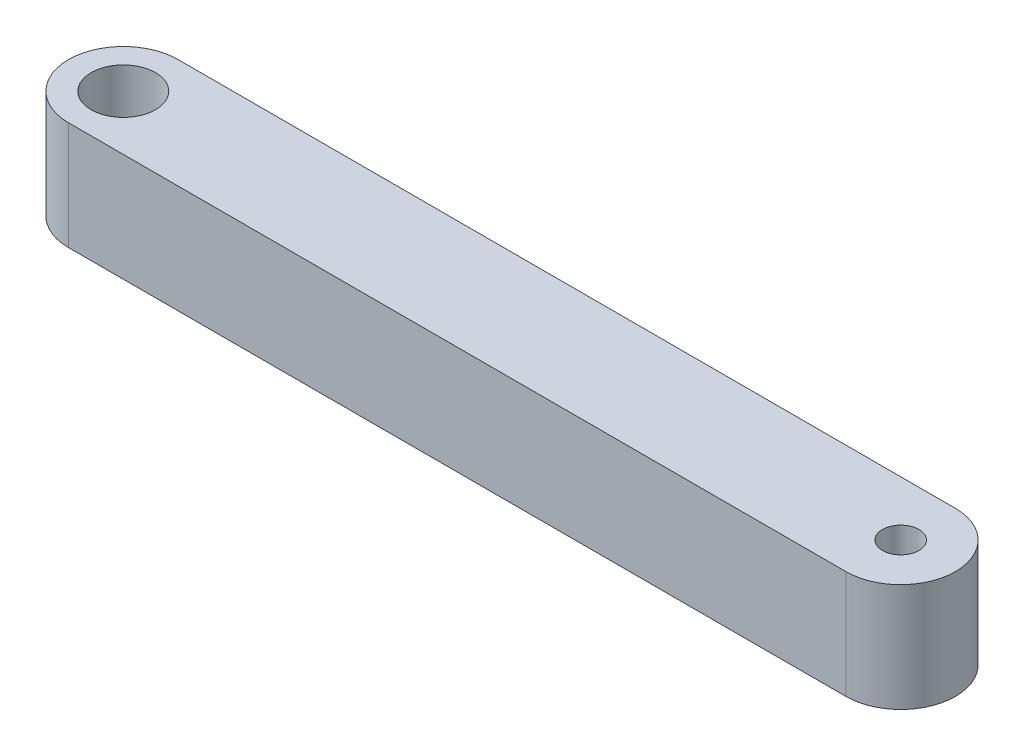
ISO-10303-21;
HEADER;
FILE_DESCRIPTION(('STEP AP214'),'2;1');
FILE_NAME('part.step','',(''),(''),'','','');
FILE_SCHEMA(('AUTOMOTIVE_DESIGN { 1 0 10303 214 1 1 1 1 }'));
ENDSEC;
DATA;
#1=APPLICATION_CONTEXT('core data for automotive mechanical design processes');
#2=APPLICATION_PROTOCOL_DEFINITION('international standard','automotive_design',2000,#1);
#3=PRODUCT_CONTEXT('',#1,'mechanical');
#4=PRODUCT('Part','Part','',(#3));
#5=PRODUCT_RELATED_PRODUCT_CATEGORY('part','',(#4));
#6=PRODUCT_DEFINITION_FORMATION('','',#4);
#7=PRODUCT_DEFINITION_CONTEXT('part definition',#1,'design');
#8=PRODUCT_DEFINITION('design','',#6,#7);
#9=PRODUCT_DEFINITION_SHAPE('','',#8);
#10=(LENGTH_UNIT() NAMED_UNIT(*) SI_UNIT(.MILLI.,.METRE.));
#11=(NAMED_UNIT(*) PLANE_ANGLE_UNIT() SI_UNIT($,.RADIAN.));
#12=(NAMED_UNIT(*) SI_UNIT($,.STERADIAN.) SOLID_ANGLE_UNIT());
#13=UNCERTAINTY_MEASURE_WITH_UNIT(LENGTH_MEASURE(1.E-05),#10,'distance_accuracy_value','');
#14=(GEOMETRIC_REPRESENTATION_CONTEXT(3) GLOBAL_UNCERTAINTY_ASSIGNED_CONTEXT((#13)) GLOBAL_UNIT_ASSIGNED_CONTEXT((#10,
#11,#12)) REPRESENTATION_CONTEXT('',''));
#15=CARTESIAN_POINT('',(0.,0.,0.));
#16=DIRECTION('',(0.,0.,1.));
#17=DIRECTION('',(1.,0.,0.));
#18=AXIS2_PLACEMENT_3D('',#15,#16,#17);
#19=CARTESIAN_POINT('',(-17.2988402061856,5.334,-1.94406013745705));
#20=DIRECTION('',(0.,1.,0.));
#21=DIRECTION('',(0.,0.,1.));
#22=AXIS2_PLACEMENT_3D('',#19,#20,#21);
#23=PLANE('',#22);
#24=CARTESIAN_POINT('',(-17.2988402061856,5.334,-1.94406013745705));
#25=DIRECTION('',(0.,1.,0.));
#26=DIRECTION('',(0.,0.,1.));
#27=AXIS2_PLACEMENT_3D('',#24,#25,#26);
#28=CIRCLE('',#27,1.5875);
#29=CARTESIAN_POINT('',(-17.2988402061856,5.334,-0.356560137457047));
#30=VERTEX_POINT('',#29);
#31=EDGE_CURVE('E118',#30,#30,#28,.T.);
#32=ORIENTED_EDGE('',*,*,#31,.F.);
#33=EDGE_LOOP('',(#32));
#34=FACE_BOUND('',#33,.T.);
#35=CARTESIAN_POINT('',(-17.2988402061856,5.334,-1.94406013745705));
#36=DIRECTION('',(0.,1.,0.));
#37=DIRECTION('',(0.,0.,1.));
#38=AXIS2_PLACEMENT_3D('',#35,#36,#37);
#39=CIRCLE('',#38,2.70191408934708);
#40=CARTESIAN_POINT('',(-17.2988402061856,5.334,-4.64597422680412));
#41=VERTEX_POINT('',#40);
#42=CARTESIAN_POINT('',(-17.2988402061856,5.334,0.757853951890033));
#43=VERTEX_POINT('',#42);
#44=EDGE_CURVE('E98',#41,#43,#39,.T.);
#45=ORIENTED_EDGE('',*,*,#44,.T.);
#46=DIRECTION('',(1.,0.,0.));
#47=VECTOR('',#46,1.);
#48=CARTESIAN_POINT('',(-17.2988402061856,5.334,0.757853951890033));
#49=LINE('',#48,#47);
#50=CARTESIAN_POINT('',(21.0551597938144,5.334,0.757853951890033));
#51=VERTEX_POINT('',#50);
#52=EDGE_CURVE('E93',#43,#51,#49,.T.);
#53=ORIENTED_EDGE('',*,*,#52,.T.);
#54=CARTESIAN_POINT('',(21.0551597938144,5.334,-1.94406013745705));
#55=DIRECTION('',(0.,1.,0.));
#56=DIRECTION('',(0.,0.,1.));
#57=AXIS2_PLACEMENT_3D('',#54,#55,#56);
#58=CIRCLE('',#57,2.70191408934708);
#59=CARTESIAN_POINT('',(21.0551597938144,5.334,-4.64597422680412));
#60=VERTEX_POINT('',#59);
#61=EDGE_CURVE('E96',#51,#60,#58,.T.);
#62=ORIENTED_EDGE('',*,*,#61,.T.);
#63=DIRECTION('',(-1.,0.,0.));
#64=VECTOR('',#63,1.);
#65=CARTESIAN_POINT('',(-17.2988402061856,5.334,-4.64597422680412));
#66=LINE('',#65,#64);
#67=EDGE_CURVE('E63',#60,#41,#66,.T.);
#68=ORIENTED_EDGE('',*,*,#67,.T.);
#69=EDGE_LOOP('',(#45,#53,#62,#68));
#70=FACE_BOUND('',#69,.T.);
#71=CARTESIAN_POINT('',(21.0551597938144,5.334,-1.94406013745705));
#72=DIRECTION('',(0.,1.,0.));
#73=DIRECTION('',(0.,0.,1.));
#74=AXIS2_PLACEMENT_3D('',#71,#72,#73);
#75=CIRCLE('',#74,0.900000000000011);
#76=CARTESIAN_POINT('',(21.0551597938144,5.334,-1.04406013745703));
#77=VERTEX_POINT('',#76);
#78=EDGE_CURVE('E140',#77,#77,#75,.T.);
#79=ORIENTED_EDGE('',*,*,#78,.F.);
#80=EDGE_LOOP('',(#79));
#81=FACE_BOUND('',#80,.T.);
#82=ADVANCED_FACE('F45',(#34,#70,#81),#23,.T.);
#83=CARTESIAN_POINT('',(-17.2988402061856,0.,-1.94406013745705));
#84=DIRECTION('',(0.,1.,0.));
#85=DIRECTION('',(0.,0.,1.));
#86=AXIS2_PLACEMENT_3D('',#83,#84,#85);
#87=PLANE('',#86);
#88=CARTESIAN_POINT('',(-17.2988402061856,0.,-1.94406013745705));
#89=DIRECTION('',(0.,1.,0.));
#90=DIRECTION('',(0.,0.,1.));
#91=AXIS2_PLACEMENT_3D('',#88,#89,#90);
#92=CIRCLE('',#91,2.70191408934708);
#93=CARTESIAN_POINT('',(-17.2988402061856,0.,-4.64597422680412));
#94=VERTEX_POINT('',#93);
#95=CARTESIAN_POINT('',(-17.2988402061856,0.,0.757853951890033));
#96=VERTEX_POINT('',#95);
#97=EDGE_CURVE('E114',#94,#96,#92,.T.);
#98=ORIENTED_EDGE('',*,*,#97,.F.);
#99=DIRECTION('',(-1.,0.,0.));
#100=VECTOR('',#99,1.);
#101=CARTESIAN_POINT('',(-17.2988402061856,0.,-4.64597422680412));
#102=LINE('',#101,#100);
#103=CARTESIAN_POINT('',(21.0551597938144,0.,-4.64597422680412));
#104=VERTEX_POINT('',#103);
#105=EDGE_CURVE('E86',#104,#94,#102,.T.);
#106=ORIENTED_EDGE('',*,*,#105,.F.);
#107=CARTESIAN_POINT('',(21.0551597938144,0.,-1.94406013745705));
#108=DIRECTION('',(0.,1.,0.));
#109=DIRECTION('',(0.,0.,1.));
#110=AXIS2_PLACEMENT_3D('',#107,#108,#109);
#111=CIRCLE('',#110,2.70191408934708);
#112=CARTESIAN_POINT('',(21.0551597938144,0.,0.757853951890033));
#113=VERTEX_POINT('',#112);
#114=EDGE_CURVE('E80',#113,#104,#111,.T.);
#115=ORIENTED_EDGE('',*,*,#114,.F.);
#116=DIRECTION('',(1.,0.,0.));
#117=VECTOR('',#116,1.);
#118=CARTESIAN_POINT('',(-17.2988402061856,0.,0.757853951890033));
#119=LINE('',#118,#117);
#120=EDGE_CURVE('E103',#96,#113,#119,.T.);
#121=ORIENTED_EDGE('',*,*,#120,.F.);
#122=EDGE_LOOP('',(#98,#106,#115,#121));
#123=FACE_BOUND('',#122,.T.);
#124=CARTESIAN_POINT('',(-17.2988402061856,0.,-1.94406013745705));
#125=DIRECTION('',(0.,1.,0.));
#126=DIRECTION('',(0.,0.,1.));
#127=AXIS2_PLACEMENT_3D('',#124,#125,#126);
#128=CIRCLE('',#127,1.5875);
#129=CARTESIAN_POINT('',(-17.2988402061856,0.,-0.356560137457047));
#130=VERTEX_POINT('',#129);
#131=EDGE_CURVE('E136',#130,#130,#128,.T.);
#132=ORIENTED_EDGE('',*,*,#131,.T.);
#133=EDGE_LOOP('',(#132));
#134=FACE_BOUND('',#133,.T.);
#135=CARTESIAN_POINT('',(21.0551597938144,0.,-1.94406013745705));
#136=DIRECTION('',(0.,1.,0.));
#137=DIRECTION('',(0.,0.,1.));
#138=AXIS2_PLACEMENT_3D('',#135,#136,#137);
#139=CIRCLE('',#138,0.900000000000011);
#140=CARTESIAN_POINT('',(21.0551597938144,0.,-1.04406013745703));
#141=VERTEX_POINT('',#140);
#142=EDGE_CURVE('E144',#141,#141,#139,.T.);
#143=ORIENTED_EDGE('',*,*,#142,.T.);
#144=EDGE_LOOP('',(#143));
#145=FACE_BOUND('',#144,.T.);
#146=ADVANCED_FACE('F131',(#123,#134,#145),#87,.F.);
#147=CARTESIAN_POINT('',(-17.2988402061856,5.334,-1.94406013745705));
#148=DIRECTION('',(0.,-1.,0.));
#149=DIRECTION('',(0.,0.,-1.));
#150=AXIS2_PLACEMENT_3D('',#147,#148,#149);
#151=CYLINDRICAL_SURFACE('',#150,2.70191408934708);
#152=ORIENTED_EDGE('',*,*,#97,.T.);
#153=DIRECTION('',(0.,-1.,0.));
#154=VECTOR('',#153,1.);
#155=CARTESIAN_POINT('',(-17.2988402061856,5.334,0.757853951890033));
#156=LINE('',#155,#154);
#157=EDGE_CURVE('E11',#43,#96,#156,.T.);
#158=ORIENTED_EDGE('',*,*,#157,.F.);
#159=ORIENTED_EDGE('',*,*,#44,.F.);
#160=DIRECTION('',(0.,-1.,0.));
#161=VECTOR('',#160,1.);
#162=CARTESIAN_POINT('',(-17.2988402061856,5.334,-4.64597422680412));
#163=LINE('',#162,#161);
#164=EDGE_CURVE('E110',#41,#94,#163,.T.);
#165=ORIENTED_EDGE('',*,*,#164,.T.);
#166=EDGE_LOOP('',(#152,#158,#159,#165));
#167=FACE_BOUND('',#166,.T.);
#168=ADVANCED_FACE('F47',(#167),#151,.T.);
#169=CARTESIAN_POINT('',(-17.2988402061856,5.334,0.757853951890033));
#170=DIRECTION('',(0.,0.,-1.));
#171=DIRECTION('',(-1.,0.,0.));
#172=AXIS2_PLACEMENT_3D('',#169,#170,#171);
#173=PLANE('',#172);
#174=ORIENTED_EDGE('',*,*,#120,.T.);
#175=DIRECTION('',(0.,-1.,0.));
#176=VECTOR('',#175,1.);
#177=CARTESIAN_POINT('',(21.0551597938144,5.334,0.757853951890033));
#178=LINE('',#177,#176);
#179=EDGE_CURVE('E55',#51,#113,#178,.T.);
#180=ORIENTED_EDGE('',*,*,#179,.F.);
#181=ORIENTED_EDGE('',*,*,#52,.F.);
#182=ORIENTED_EDGE('',*,*,#157,.T.);
#183=EDGE_LOOP('',(#174,#180,#181,#182));
#184=FACE_BOUND('',#183,.T.);
#185=ADVANCED_FACE('F102',(#184),#173,.F.);
#186=CARTESIAN_POINT('',(21.0551597938144,5.334,-1.94406013745705));
#187=DIRECTION('',(0.,-1.,0.));
#188=DIRECTION('',(0.,0.,-1.));
#189=AXIS2_PLACEMENT_3D('',#186,#187,#188);
#190=CYLINDRICAL_SURFACE('',#189,2.70191408934708);
#191=ORIENTED_EDGE('',*,*,#114,.T.);
#192=DIRECTION('',(0.,-1.,0.));
#193=VECTOR('',#192,1.);
#194=CARTESIAN_POINT('',(21.0551597938144,5.334,-4.64597422680412));
#195=LINE('',#194,#193);
#196=EDGE_CURVE('E105',#60,#104,#195,.T.);
#197=ORIENTED_EDGE('',*,*,#196,.F.);
#198=ORIENTED_EDGE('',*,*,#61,.F.);
#199=ORIENTED_EDGE('',*,*,#179,.T.);
#200=EDGE_LOOP('',(#191,#197,#198,#199));
#201=FACE_BOUND('',#200,.T.);
#202=ADVANCED_FACE('F106',(#201),#190,.T.);
#203=CARTESIAN_POINT('',(-17.2988402061856,5.334,-4.64597422680412));
#204=DIRECTION('',(0.,0.,1.));
#205=DIRECTION('',(1.,0.,0.));
#206=AXIS2_PLACEMENT_3D('',#203,#204,#205);
#207=PLANE('',#206);
#208=ORIENTED_EDGE('',*,*,#105,.T.);
#209=ORIENTED_EDGE('',*,*,#164,.F.);
#210=ORIENTED_EDGE('',*,*,#67,.F.);
#211=ORIENTED_EDGE('',*,*,#196,.T.);
#212=EDGE_LOOP('',(#208,#209,#210,#211));
#213=FACE_BOUND('',#212,.T.);
#214=ADVANCED_FACE('F128',(#213),#207,.F.);
#215=CARTESIAN_POINT('',(-17.2988402061856,5.334,-1.94406013745705));
#216=DIRECTION('',(0.,-1.,0.));
#217=DIRECTION('',(0.,0.,-1.));
#218=AXIS2_PLACEMENT_3D('',#215,#216,#217);
#219=CYLINDRICAL_SURFACE('',#218,1.5875);
#220=ORIENTED_EDGE('',*,*,#31,.T.);
#221=EDGE_LOOP('',(#220));
#222=FACE_BOUND('',#221,.T.);
#223=ORIENTED_EDGE('',*,*,#131,.F.);
#224=EDGE_LOOP('',(#223));
#225=FACE_BOUND('',#224,.T.);
#226=ADVANCED_FACE('F163',(#222,#225),#219,.F.);
#227=CARTESIAN_POINT('',(21.0551597938144,5.334,-1.94406013745705));
#228=DIRECTION('',(0.,-1.,0.));
#229=DIRECTION('',(0.,0.,-1.));
#230=AXIS2_PLACEMENT_3D('',#227,#228,#229);
#231=CYLINDRICAL_SURFACE('',#230,0.900000000000011);
#232=ORIENTED_EDGE('',*,*,#78,.T.);
#233=EDGE_LOOP('',(#232));
#234=FACE_BOUND('',#233,.T.);
#235=ORIENTED_EDGE('',*,*,#142,.F.);
#236=EDGE_LOOP('',(#235));
#237=FACE_BOUND('',#236,.T.);
#238=ADVANCED_FACE('F152',(#234,#237),#231,.F.);
#239=CLOSED_SHELL('',(#82,#146,#168,#185,#202,#214,#226,#238));
#240=MANIFOLD_SOLID_BREP('B2',#239);
#241=ADVANCED_BREP_SHAPE_REPRESENTATION('',(#18,#240),#14);
#242=SHAPE_DEFINITION_REPRESENTATION(#9,#241);
ENDSEC;
END-ISO-10303-21;
